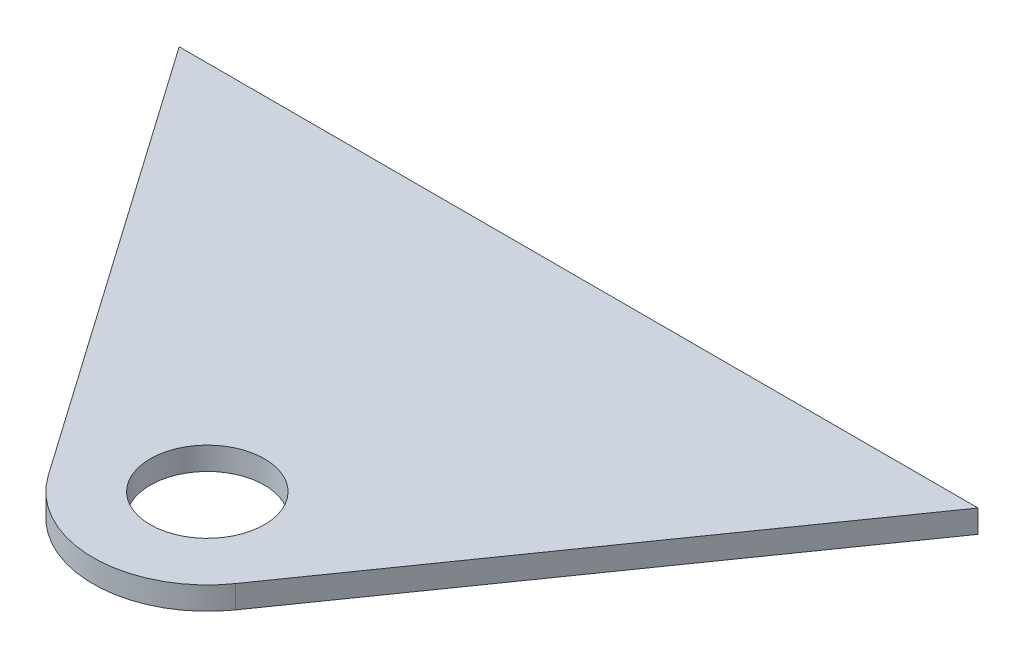
ISO-10303-21;
HEADER;
FILE_DESCRIPTION(('STEP AP214'),'2;1');
FILE_NAME('part.step','',(''),(''),'','','');
FILE_SCHEMA(('AUTOMOTIVE_DESIGN { 1 0 10303 214 1 1 1 1 }'));
ENDSEC;
DATA;
#1=APPLICATION_CONTEXT('core data for automotive mechanical design processes');
#2=APPLICATION_PROTOCOL_DEFINITION('international standard','automotive_design',2000,#1);
#3=PRODUCT_CONTEXT('',#1,'mechanical');
#4=PRODUCT('Part','Part','',(#3));
#5=PRODUCT_RELATED_PRODUCT_CATEGORY('part','',(#4));
#6=PRODUCT_DEFINITION_FORMATION('','',#4);
#7=PRODUCT_DEFINITION_CONTEXT('part definition',#1,'design');
#8=PRODUCT_DEFINITION('design','',#6,#7);
#9=PRODUCT_DEFINITION_SHAPE('','',#8);
#10=(LENGTH_UNIT() NAMED_UNIT(*) SI_UNIT(.MILLI.,.METRE.));
#11=(NAMED_UNIT(*) PLANE_ANGLE_UNIT() SI_UNIT($,.RADIAN.));
#12=(NAMED_UNIT(*) SI_UNIT($,.STERADIAN.) SOLID_ANGLE_UNIT());
#13=UNCERTAINTY_MEASURE_WITH_UNIT(LENGTH_MEASURE(1.E-05),#10,'distance_accuracy_value','');
#14=(GEOMETRIC_REPRESENTATION_CONTEXT(3) GLOBAL_UNCERTAINTY_ASSIGNED_CONTEXT((#13)) GLOBAL_UNIT_ASSIGNED_CONTEXT((#10,
#11,#12)) REPRESENTATION_CONTEXT('',''));
#15=CARTESIAN_POINT('',(0.,0.,0.));
#16=DIRECTION('',(0.,0.,1.));
#17=DIRECTION('',(1.,0.,0.));
#18=AXIS2_PLACEMENT_3D('',#15,#16,#17);
#19=CARTESIAN_POINT('',(0.,2.54,0.));
#20=DIRECTION('',(0.,1.,0.));
#21=DIRECTION('',(0.,0.,1.));
#22=AXIS2_PLACEMENT_3D('',#19,#20,#21);
#23=PLANE('',#22);
#24=DIRECTION('',(0.57357643635105,0.,0.819152044288989));
#25=VECTOR('',#24,1.);
#26=CARTESIAN_POINT('',(-10.4032309624702,2.54,7.28442074165835));
#27=LINE('',#26,#25);
#28=CARTESIAN_POINT('',(-44.4049034168766,2.54,-41.275));
#29=VERTEX_POINT('',#28);
#30=CARTESIAN_POINT('',(-10.4032309624702,2.54,7.28442074165834));
#31=VERTEX_POINT('',#30);
#32=EDGE_CURVE('E100',#29,#31,#27,.T.);
#33=ORIENTED_EDGE('',*,*,#32,.T.);
#34=CARTESIAN_POINT('',(0.,2.54,0.));
#35=DIRECTION('',(0.,1.,0.));
#36=DIRECTION('',(0.,0.,1.));
#37=AXIS2_PLACEMENT_3D('',#34,#35,#36);
#38=CIRCLE('',#37,12.7);
#39=CARTESIAN_POINT('',(10.4032309624702,2.54,7.28442074165833));
#40=VERTEX_POINT('',#39);
#41=EDGE_CURVE('E95',#31,#40,#38,.T.);
#42=ORIENTED_EDGE('',*,*,#41,.T.);
#43=DIRECTION('',(0.57357643635105,0.,-0.819152044288989));
#44=VECTOR('',#43,1.);
#45=CARTESIAN_POINT('',(10.4032309624702,2.54,7.28442074165833));
#46=LINE('',#45,#44);
#47=CARTESIAN_POINT('',(44.4049034168766,2.54,-41.275));
#48=VERTEX_POINT('',#47);
#49=EDGE_CURVE('E98',#40,#48,#46,.T.);
#50=ORIENTED_EDGE('',*,*,#49,.T.);
#51=DIRECTION('',(-1.,0.,0.));
#52=VECTOR('',#51,1.);
#53=CARTESIAN_POINT('',(44.4049034168766,2.54,-41.275));
#54=LINE('',#53,#52);
#55=EDGE_CURVE('E65',#48,#29,#54,.T.);
#56=ORIENTED_EDGE('',*,*,#55,.T.);
#57=EDGE_LOOP('',(#33,#42,#50,#56));
#58=FACE_BOUND('',#57,.T.);
#59=CARTESIAN_POINT('',(0.,2.54,0.));
#60=DIRECTION('',(0.,1.,0.));
#61=DIRECTION('',(0.,0.,1.));
#62=AXIS2_PLACEMENT_3D('',#59,#60,#61);
#63=CIRCLE('',#62,6.35);
#64=CARTESIAN_POINT('',(0.,2.54,6.35));
#65=VERTEX_POINT('',#64);
#66=EDGE_CURVE('E120',#65,#65,#63,.T.);
#67=ORIENTED_EDGE('',*,*,#66,.F.);
#68=EDGE_LOOP('',(#67));
#69=FACE_BOUND('',#68,.T.);
#70=ADVANCED_FACE('F45',(#58,#69),#23,.T.);
#71=CARTESIAN_POINT('',(0.,0.,0.));
#72=DIRECTION('',(0.,1.,0.));
#73=DIRECTION('',(0.,0.,1.));
#74=AXIS2_PLACEMENT_3D('',#71,#72,#73);
#75=PLANE('',#74);
#76=DIRECTION('',(0.57357643635105,0.,0.819152044288989));
#77=VECTOR('',#76,1.);
#78=CARTESIAN_POINT('',(-10.4032309624702,0.,7.28442074165835));
#79=LINE('',#78,#77);
#80=CARTESIAN_POINT('',(-44.4049034168766,0.,-41.275));
#81=VERTEX_POINT('',#80);
#82=CARTESIAN_POINT('',(-10.4032309624702,0.,7.28442074165834));
#83=VERTEX_POINT('',#82);
#84=EDGE_CURVE('E116',#81,#83,#79,.T.);
#85=ORIENTED_EDGE('',*,*,#84,.F.);
#86=DIRECTION('',(-1.,0.,0.));
#87=VECTOR('',#86,1.);
#88=CARTESIAN_POINT('',(44.4049034168766,0.,-41.275));
#89=LINE('',#88,#87);
#90=CARTESIAN_POINT('',(44.4049034168766,0.,-41.275));
#91=VERTEX_POINT('',#90);
#92=EDGE_CURVE('E88',#91,#81,#89,.T.);
#93=ORIENTED_EDGE('',*,*,#92,.F.);
#94=DIRECTION('',(0.57357643635105,0.,-0.819152044288989));
#95=VECTOR('',#94,1.);
#96=CARTESIAN_POINT('',(10.4032309624702,0.,7.28442074165833));
#97=LINE('',#96,#95);
#98=CARTESIAN_POINT('',(10.4032309624702,0.,7.28442074165833));
#99=VERTEX_POINT('',#98);
#100=EDGE_CURVE('E82',#99,#91,#97,.T.);
#101=ORIENTED_EDGE('',*,*,#100,.F.);
#102=CARTESIAN_POINT('',(0.,0.,0.));
#103=DIRECTION('',(0.,1.,0.));
#104=DIRECTION('',(0.,0.,1.));
#105=AXIS2_PLACEMENT_3D('',#102,#103,#104);
#106=CIRCLE('',#105,12.7);
#107=EDGE_CURVE('E105',#83,#99,#106,.T.);
#108=ORIENTED_EDGE('',*,*,#107,.F.);
#109=EDGE_LOOP('',(#85,#93,#101,#108));
#110=FACE_BOUND('',#109,.T.);
#111=CARTESIAN_POINT('',(0.,0.,0.));
#112=DIRECTION('',(0.,1.,0.));
#113=DIRECTION('',(0.,0.,1.));
#114=AXIS2_PLACEMENT_3D('',#111,#112,#113);
#115=CIRCLE('',#114,6.35);
#116=CARTESIAN_POINT('',(0.,0.,6.35));
#117=VERTEX_POINT('',#116);
#118=EDGE_CURVE('E138',#117,#117,#115,.T.);
#119=ORIENTED_EDGE('',*,*,#118,.T.);
#120=EDGE_LOOP('',(#119));
#121=FACE_BOUND('',#120,.T.);
#122=ADVANCED_FACE('F133',(#110,#121),#75,.F.);
#123=CARTESIAN_POINT('',(-10.4032309624702,2.54,7.28442074165835));
#124=DIRECTION('',(0.819152044288989,0.,-0.57357643635105));
#125=DIRECTION('',(-0.57357643635105,0.,-0.819152044288989));
#126=AXIS2_PLACEMENT_3D('',#123,#124,#125);
#127=PLANE('',#126);
#128=ORIENTED_EDGE('',*,*,#84,.T.);
#129=DIRECTION('',(0.,-1.,0.));
#130=VECTOR('',#129,1.);
#131=CARTESIAN_POINT('',(-10.4032309624702,2.54,7.28442074165834));
#132=LINE('',#131,#130);
#133=EDGE_CURVE('E11',#31,#83,#132,.T.);
#134=ORIENTED_EDGE('',*,*,#133,.F.);
#135=ORIENTED_EDGE('',*,*,#32,.F.);
#136=DIRECTION('',(0.,-1.,0.));
#137=VECTOR('',#136,1.);
#138=CARTESIAN_POINT('',(-44.4049034168766,2.54,-41.275));
#139=LINE('',#138,#137);
#140=EDGE_CURVE('E112',#29,#81,#139,.T.);
#141=ORIENTED_EDGE('',*,*,#140,.T.);
#142=EDGE_LOOP('',(#128,#134,#135,#141));
#143=FACE_BOUND('',#142,.T.);
#144=ADVANCED_FACE('F47',(#143),#127,.F.);
#145=CARTESIAN_POINT('',(0.,2.54,0.));
#146=DIRECTION('',(0.,-1.,0.));
#147=DIRECTION('',(0.,0.,-1.));
#148=AXIS2_PLACEMENT_3D('',#145,#146,#147);
#149=CYLINDRICAL_SURFACE('',#148,12.7);
#150=ORIENTED_EDGE('',*,*,#107,.T.);
#151=DIRECTION('',(0.,-1.,0.));
#152=VECTOR('',#151,1.);
#153=CARTESIAN_POINT('',(10.4032309624702,2.54,7.28442074165833));
#154=LINE('',#153,#152);
#155=EDGE_CURVE('E55',#40,#99,#154,.T.);
#156=ORIENTED_EDGE('',*,*,#155,.F.);
#157=ORIENTED_EDGE('',*,*,#41,.F.);
#158=ORIENTED_EDGE('',*,*,#133,.T.);
#159=EDGE_LOOP('',(#150,#156,#157,#158));
#160=FACE_BOUND('',#159,.T.);
#161=ADVANCED_FACE('F104',(#160),#149,.T.);
#162=CARTESIAN_POINT('',(10.4032309624702,2.54,7.28442074165833));
#163=DIRECTION('',(-0.819152044288989,0.,-0.57357643635105));
#164=DIRECTION('',(-0.57357643635105,0.,0.819152044288989));
#165=AXIS2_PLACEMENT_3D('',#162,#163,#164);
#166=PLANE('',#165);
#167=ORIENTED_EDGE('',*,*,#100,.T.);
#168=DIRECTION('',(0.,-1.,0.));
#169=VECTOR('',#168,1.);
#170=CARTESIAN_POINT('',(44.4049034168766,2.54,-41.275));
#171=LINE('',#170,#169);
#172=EDGE_CURVE('E107',#48,#91,#171,.T.);
#173=ORIENTED_EDGE('',*,*,#172,.F.);
#174=ORIENTED_EDGE('',*,*,#49,.F.);
#175=ORIENTED_EDGE('',*,*,#155,.T.);
#176=EDGE_LOOP('',(#167,#173,#174,#175));
#177=FACE_BOUND('',#176,.T.);
#178=ADVANCED_FACE('F108',(#177),#166,.F.);
#179=CARTESIAN_POINT('',(44.4049034168766,2.54,-41.275));
#180=DIRECTION('',(0.,0.,1.));
#181=DIRECTION('',(1.,0.,0.));
#182=AXIS2_PLACEMENT_3D('',#179,#180,#181);
#183=PLANE('',#182);
#184=ORIENTED_EDGE('',*,*,#92,.T.);
#185=ORIENTED_EDGE('',*,*,#140,.F.);
#186=ORIENTED_EDGE('',*,*,#55,.F.);
#187=ORIENTED_EDGE('',*,*,#172,.T.);
#188=EDGE_LOOP('',(#184,#185,#186,#187));
#189=FACE_BOUND('',#188,.T.);
#190=ADVANCED_FACE('F130',(#189),#183,.F.);
#191=CARTESIAN_POINT('',(0.,2.54,0.));
#192=DIRECTION('',(0.,-1.,0.));
#193=DIRECTION('',(0.,0.,-1.));
#194=AXIS2_PLACEMENT_3D('',#191,#192,#193);
#195=CYLINDRICAL_SURFACE('',#194,6.35);
#196=ORIENTED_EDGE('',*,*,#66,.T.);
#197=EDGE_LOOP('',(#196));
#198=FACE_BOUND('',#197,.T.);
#199=ORIENTED_EDGE('',*,*,#118,.F.);
#200=EDGE_LOOP('',(#199));
#201=FACE_BOUND('',#200,.T.);
#202=ADVANCED_FACE('F147',(#198,#201),#195,.F.);
#203=CLOSED_SHELL('',(#70,#122,#144,#161,#178,#190,#202));
#204=MANIFOLD_SOLID_BREP('B2',#203);
#205=ADVANCED_BREP_SHAPE_REPRESENTATION('',(#18,#204),#14);
#206=SHAPE_DEFINITION_REPRESENTATION(#9,#205);
ENDSEC;
END-ISO-10303-21;
